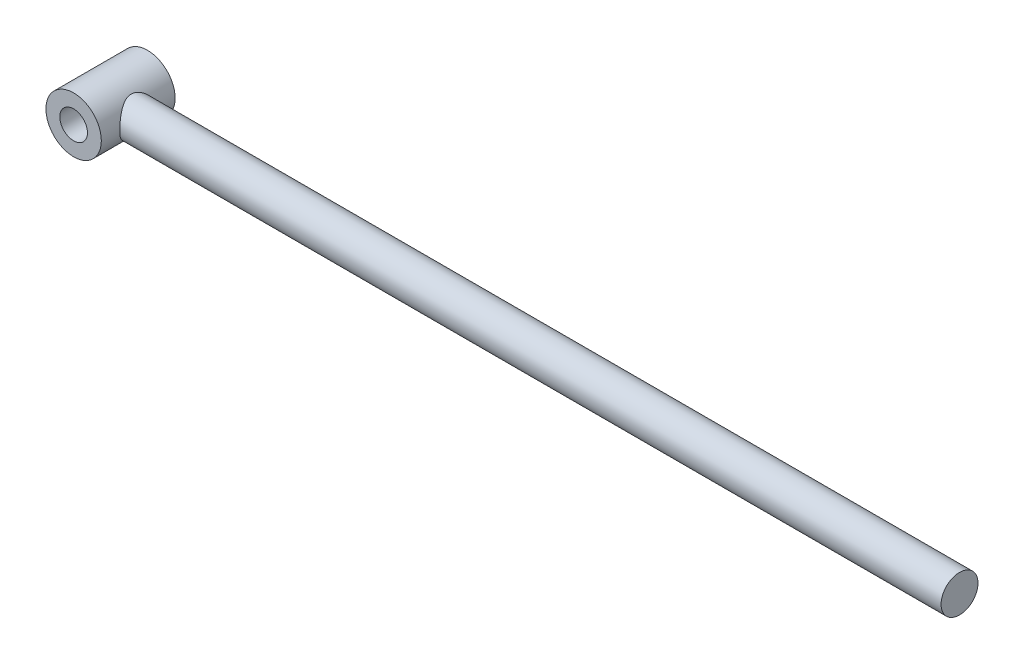
ISO-10303-21;
HEADER;
FILE_DESCRIPTION(('STEP AP214'),'2;1');
FILE_NAME('part.step','',(''),(''),'','','');
FILE_SCHEMA(('AUTOMOTIVE_DESIGN { 1 0 10303 214 1 1 1 1 }'));
ENDSEC;
DATA;
#1=APPLICATION_CONTEXT('core data for automotive mechanical design processes');
#2=APPLICATION_PROTOCOL_DEFINITION('international standard','automotive_design',2000,#1);
#3=PRODUCT_CONTEXT('',#1,'mechanical');
#4=PRODUCT('Part','Part','',(#3));
#5=PRODUCT_RELATED_PRODUCT_CATEGORY('part','',(#4));
#6=PRODUCT_DEFINITION_FORMATION('','',#4);
#7=PRODUCT_DEFINITION_CONTEXT('part definition',#1,'design');
#8=PRODUCT_DEFINITION('design','',#6,#7);
#9=PRODUCT_DEFINITION_SHAPE('','',#8);
#10=(LENGTH_UNIT() NAMED_UNIT(*) SI_UNIT(.MILLI.,.METRE.));
#11=(NAMED_UNIT(*) PLANE_ANGLE_UNIT() SI_UNIT($,.RADIAN.));
#12=(NAMED_UNIT(*) SI_UNIT($,.STERADIAN.) SOLID_ANGLE_UNIT());
#13=UNCERTAINTY_MEASURE_WITH_UNIT(LENGTH_MEASURE(1.E-05),#10,'distance_accuracy_value','');
#14=(GEOMETRIC_REPRESENTATION_CONTEXT(3) GLOBAL_UNCERTAINTY_ASSIGNED_CONTEXT((#13)) GLOBAL_UNIT_ASSIGNED_CONTEXT((#10,
#11,#12)) REPRESENTATION_CONTEXT('',''));
#15=CARTESIAN_POINT('',(0.,0.,0.));
#16=DIRECTION('',(0.,0.,1.));
#17=DIRECTION('',(1.,0.,0.));
#18=AXIS2_PLACEMENT_3D('',#15,#16,#17);
#19=CARTESIAN_POINT('',(0.,0.,40.));
#20=DIRECTION('',(0.,0.,-1.));
#21=DIRECTION('',(-1.,0.,0.));
#22=AXIS2_PLACEMENT_3D('',#19,#20,#21);
#23=CYLINDRICAL_SURFACE('',#22,30.);
#24=CARTESIAN_POINT('',(0.,0.,40.));
#25=DIRECTION('',(0.,0.,1.));
#26=DIRECTION('',(1.,0.,0.));
#27=AXIS2_PLACEMENT_3D('',#24,#25,#26);
#28=CIRCLE('',#27,30.);
#29=CARTESIAN_POINT('',(30.,0.,40.));
#30=VERTEX_POINT('',#29);
#31=EDGE_CURVE('E51',#30,#30,#28,.T.);
#32=ORIENTED_EDGE('',*,*,#31,.F.);
#33=EDGE_LOOP('',(#32));
#34=FACE_BOUND('',#33,.T.);
#35=CARTESIAN_POINT('',(0.,0.,-40.));
#36=DIRECTION('',(0.,0.,1.));
#37=DIRECTION('',(1.,0.,0.));
#38=AXIS2_PLACEMENT_3D('',#35,#36,#37);
#39=CIRCLE('',#38,30.);
#40=CARTESIAN_POINT('',(30.,0.,-40.));
#41=VERTEX_POINT('',#40);
#42=EDGE_CURVE('E56',#41,#41,#39,.T.);
#43=ORIENTED_EDGE('',*,*,#42,.T.);
#44=EDGE_LOOP('',(#43));
#45=FACE_BOUND('',#44,.T.);
#46=CARTESIAN_POINT('',(30.,0.,20.));
#47=CARTESIAN_POINT('',(29.9999998661981,-0.502432050357107,19.9999998708156));
#48=CARTESIAN_POINT('',(29.9873512767924,-1.00486659291617,19.981041890221));
#49=CARTESIAN_POINT('',(29.9370754507124,-2.00562861223446,19.9055087079442));
#50=CARTESIAN_POINT('',(29.8994480825663,-2.50395606736271,19.8489333082686));
#51=CARTESIAN_POINT('',(29.8001252135495,-3.49278874290095,19.6990002879968));
#52=CARTESIAN_POINT('',(29.7384203306489,-3.98329083644028,19.6056283291341));
#53=CARTESIAN_POINT('',(29.5924098661005,-4.9527367018995,19.3834395211629));
#54=CARTESIAN_POINT('',(29.5081040111715,-5.43168033398314,19.2546222434644));
#55=CARTESIAN_POINT('',(29.3192451350848,-6.3726831529905,18.9639204802124));
#56=CARTESIAN_POINT('',(29.2147907649452,-6.83481207132658,18.8021969068242));
#57=CARTESIAN_POINT('',(28.987567335659,-7.74207070686117,18.4471586375469));
#58=CARTESIAN_POINT('',(28.864798371266,-8.18720051199242,18.2538441050984));
#59=CARTESIAN_POINT('',(28.6033482003015,-9.05844037609498,17.8375381124749));
#60=CARTESIAN_POINT('',(28.4646675126729,-9.48455105472426,17.6145476201097));
#61=CARTESIAN_POINT('',(28.1739113247129,-10.3162415378409,17.1407197895657));
#62=CARTESIAN_POINT('',(28.0218342454824,-10.7218189133778,16.88987916806));
#63=CARTESIAN_POINT('',(27.6935578417576,-11.544666651525,16.3397046695659));
#64=CARTESIAN_POINT('',(27.5164065024113,-11.9600134544702,16.0380625153589));
#65=CARTESIAN_POINT('',(27.1528656210948,-12.7638755092378,15.4060039283267));
#66=CARTESIAN_POINT('',(26.9664756598522,-13.1523895414017,15.0755861890756));
#67=CARTESIAN_POINT('',(26.5877396332004,-13.9021114634373,14.3871695519229));
#68=CARTESIAN_POINT('',(26.3953859507486,-14.2632822184454,14.0291344326562));
#69=CARTESIAN_POINT('',(26.0086530551827,-14.9568597365416,13.2872215493219));
#70=CARTESIAN_POINT('',(25.8142737230126,-15.2892647981446,12.9033422589614));
#71=CARTESIAN_POINT('',(25.396836648899,-15.9745417178036,12.0482275933553));
#72=CARTESIAN_POINT('',(25.174096536266,-16.3223586443349,11.5727693191127));
#73=CARTESIAN_POINT('',(24.7376939344548,-16.9764877633748,10.5899657994356));
#74=CARTESIAN_POINT('',(24.5240335140448,-17.2827905315006,10.0826133516483));
#75=CARTESIAN_POINT('',(24.1134541975624,-17.8511644026812,9.03819236671138));
#76=CARTESIAN_POINT('',(23.9165127661255,-18.1132955295477,8.50116549380746));
#77=CARTESIAN_POINT('',(23.5472211433069,-18.5908454263022,7.39870988362545));
#78=CARTESIAN_POINT('',(23.3748591544978,-18.8062866319954,6.83329494920044));
#79=CARTESIAN_POINT('',(23.1083554699939,-19.13202887715,5.84404921175392));
#80=CARTESIAN_POINT('',(23.0059988256492,-19.254726201792,5.42648017350507));
#81=CARTESIAN_POINT('',(22.8211903176783,-19.4734126020971,4.58008091505703));
#82=CARTESIAN_POINT('',(22.7387352052499,-19.5694060373963,4.15125254556424));
#83=CARTESIAN_POINT('',(22.5966842761104,-19.7332623242764,3.28516192271634));
#84=CARTESIAN_POINT('',(22.5370547106277,-19.8011667190628,2.84791313270976));
#85=CARTESIAN_POINT('',(22.442775186748,-19.9079619855319,1.96717747103349));
#86=CARTESIAN_POINT('',(22.4081253652476,-19.9468526982109,1.5236905651906));
#87=CARTESIAN_POINT('',(22.3651578047493,-19.995018995311,0.631973802665962));
#88=CARTESIAN_POINT('',(22.3569497015249,-20.0041712760879,0.183731910267435));
#89=CARTESIAN_POINT('',(22.3675301691013,-19.9923398271623,-0.712030658740458));
#90=CARTESIAN_POINT('',(22.3863188316053,-19.971355995093,-1.15955133289481));
#91=CARTESIAN_POINT('',(22.4501086857203,-19.8996205096492,-2.050625095392));
#92=CARTESIAN_POINT('',(22.4951293541334,-19.8488467375743,-2.49417498677212));
#93=CARTESIAN_POINT('',(22.6095581655225,-19.7184018881212,-3.37377492739303));
#94=CARTESIAN_POINT('',(22.6789667736164,-19.6387302596127,-3.80982483343045));
#95=CARTESIAN_POINT('',(22.8360020403641,-19.4558684710411,-4.65260599507371));
#96=CARTESIAN_POINT('',(22.9226794986437,-19.3538839737256,-5.05977803330656));
#97=CARTESIAN_POINT('',(23.1133089528256,-19.1258219416928,-5.86323587316174));
#98=CARTESIAN_POINT('',(23.2172676308142,-18.9997350845369,-6.25951739443491));
#99=CARTESIAN_POINT('',(23.5509005263236,-18.5870898788947,-7.42993067111853));
#100=CARTESIAN_POINT('',(23.8024209013306,-18.2660472919538,-8.18608179416508));
#101=CARTESIAN_POINT('',(24.2342569329526,-17.6854431992285,-9.35228726673066));
#102=CARTESIAN_POINT('',(24.403077317783,-17.4522559964646,-9.78032481496439));
#103=CARTESIAN_POINT('',(24.7497432705651,-16.9570483876589,-10.6157476442302));
#104=CARTESIAN_POINT('',(24.9275896995493,-16.6950252280375,-11.023130947529));
#105=CARTESIAN_POINT('',(25.2885468949722,-16.1430567151301,-11.8167546644321));
#106=CARTESIAN_POINT('',(25.471663237886,-15.8530809594392,-12.2029713238621));
#107=CARTESIAN_POINT('',(25.8393965051977,-15.246358714758,-12.9530389311317));
#108=CARTESIAN_POINT('',(26.024013528533,-14.9296104475491,-13.3168883905748));
#109=CARTESIAN_POINT('',(26.4310497738324,-14.1989483888887,-14.097303197129));
#110=CARTESIAN_POINT('',(26.6530303956695,-13.7788159652825,-14.5083033678111));
#111=CARTESIAN_POINT('',(27.0885965336176,-12.9014676729698,-15.2937513429522));
#112=CARTESIAN_POINT('',(27.3021805000215,-12.4442450060576,-15.6681924187186));
#113=CARTESIAN_POINT('',(27.7153401348638,-11.4946861176089,-16.3775183221479));
#114=CARTESIAN_POINT('',(27.9149260225621,-11.0023760522687,-16.7124321311584));
#115=CARTESIAN_POINT('',(28.2949676279155,-9.98447354240779,-17.3397652164747));
#116=CARTESIAN_POINT('',(28.4754286055529,-9.45889031296221,-17.6321961852127));
#117=CARTESIAN_POINT('',(28.7791644068812,-8.4833461227497,-18.1181905483136));
#118=CARTESIAN_POINT('',(28.9067147978732,-8.03875717640116,-18.3198975753372));
#119=CARTESIAN_POINT('',(29.1437173052015,-7.13185034835575,-18.691623162803));
#120=CARTESIAN_POINT('',(29.2531715370476,-6.66953454679109,-18.8616454276103));
#121=CARTESIAN_POINT('',(29.4516277514227,-5.7299227277189,-19.1679937956703));
#122=CARTESIAN_POINT('',(29.5406434674396,-5.25263701566193,-19.3043425302522));
#123=CARTESIAN_POINT('',(29.6963305492252,-4.28575432400347,-19.5417523912564));
#124=CARTESIAN_POINT('',(29.7630015712691,-3.79615715514135,-19.6428129748477));
#125=CARTESIAN_POINT('',(29.872657894971,-2.80597314349125,-19.8085733139663));
#126=CARTESIAN_POINT('',(29.9155383206477,-2.30534759903096,-19.8731120951364));
#127=CARTESIAN_POINT('',(29.9760956021539,-1.29911991465958,-19.9641545523483));
#128=CARTESIAN_POINT('',(29.9937724250504,-0.793517768246534,-19.9906581786905));
#129=CARTESIAN_POINT('',(30.0034717951189,0.218464736427053,-20.0052080328604));
#130=CARTESIAN_POINT('',(29.9954953996663,0.724845061752678,-19.9932558457617));
#131=CARTESIAN_POINT('',(29.9540933231667,1.73418156784465,-19.931087455494));
#132=CARTESIAN_POINT('',(29.9206687283027,2.23713789383013,-19.8808728854445));
#133=CARTESIAN_POINT('',(29.8324414506934,3.20042176411033,-19.7478312691314));
#134=CARTESIAN_POINT('',(29.7793090042603,3.66125811656818,-19.6675483452082));
#135=CARTESIAN_POINT('',(29.6529106481444,4.57350157570509,-19.4756341111471));
#136=CARTESIAN_POINT('',(29.5796458717002,5.02490921158323,-19.3640045654864));
#137=CARTESIAN_POINT('',(29.4144446665676,5.91571607198156,-19.1106977521881));
#138=CARTESIAN_POINT('',(29.3225070223762,6.35511451265425,-18.9690185284518));
#139=CARTESIAN_POINT('',(29.1217004947068,7.21966385402625,-18.6571079304231));
#140=CARTESIAN_POINT('',(29.0128307093883,7.64481399436505,-18.486875035266));
#141=CARTESIAN_POINT('',(28.7730488442419,8.50426678457443,-18.1083152340667));
#142=CARTESIAN_POINT('',(28.641201691667,8.93756698372232,-17.8983067263232));
#143=CARTESIAN_POINT('',(28.3631030211141,9.78432512725706,-17.449829798643));
#144=CARTESIAN_POINT('',(28.2168510697156,10.1977824740429,-17.2113605223154));
#145=CARTESIAN_POINT('',(27.9124418593605,11.0036909497809,-16.7076242018634));
#146=CARTESIAN_POINT('',(27.7542793038351,11.3961325988641,-16.4423452174859));
#147=CARTESIAN_POINT('',(27.4287361682711,12.1587990167243,-15.8866695617355));
#148=CARTESIAN_POINT('',(27.2613545613898,12.5290213010131,-15.5962700903114));
#149=CARTESIAN_POINT('',(26.8930879740092,13.3031347178692,-14.9439528947196));
#150=CARTESIAN_POINT('',(26.6910905163229,13.7030923841241,-14.5779874749765));
#151=CARTESIAN_POINT('',(26.2826982946006,14.4709683638239,-13.8160664974289));
#152=CARTESIAN_POINT('',(26.0763029510259,14.8388824217615,-13.4201069693141));
#153=CARTESIAN_POINT('',(25.6635739697582,15.5417880165119,-12.5994023240134));
#154=CARTESIAN_POINT('',(25.4572404691787,15.876757023597,-12.174637839138));
#155=CARTESIAN_POINT('',(25.0497261492331,16.5122275702686,-11.2977646153286));
#156=CARTESIAN_POINT('',(24.8485448051984,16.81273263041,-10.8456586765927));
#157=CARTESIAN_POINT('',(24.4733023029991,17.3538627139578,-9.95448274755281));
#158=CARTESIAN_POINT('',(24.2983863656877,17.5974024349064,-9.51754297050518));
#159=CARTESIAN_POINT('',(23.9619407246742,18.0528546349536,-8.62244520074572));
#160=CARTESIAN_POINT('',(23.8004112149102,18.2647666558762,-8.16428690077693));
#161=CARTESIAN_POINT('',(23.4959190621918,18.6548371117046,-7.22866142786252));
#162=CARTESIAN_POINT('',(23.352929353255,18.8330449293941,-6.75122376801286));
#163=CARTESIAN_POINT('',(23.0904591353035,19.1539484457238,-5.77827480129949));
#164=CARTESIAN_POINT('',(22.9709732247938,19.2966523056608,-5.28276767814733));
#165=CARTESIAN_POINT('',(22.7795445121487,19.5220414226083,-4.36698264384053));
#166=CARTESIAN_POINT('',(22.7029160837044,19.6109049179647,-3.94920001271946));
#167=CARTESIAN_POINT('',(22.5714513943609,19.7620762933325,-3.1054686934564));
#168=CARTESIAN_POINT('',(22.5166125085731,19.82438737206,-2.6795209954077));
#169=CARTESIAN_POINT('',(22.4307802243878,19.9214537495162,-1.8224911908299));
#170=CARTESIAN_POINT('',(22.3997648547817,19.9562344390175,-1.39141418836717));
#171=CARTESIAN_POINT('',(22.3627151772862,19.9977438544737,-0.526818989046352));
#172=CARTESIAN_POINT('',(22.3566812339737,20.0044721710347,-0.093300756653625));
#173=CARTESIAN_POINT('',(22.3698449862022,19.9897505651309,0.773115287328889));
#174=CARTESIAN_POINT('',(22.3890570855061,19.9682845568072,1.20601260355544));
#175=CARTESIAN_POINT('',(22.4519644396444,19.89752521375,2.06770261584204));
#176=CARTESIAN_POINT('',(22.4956594937704,19.8482321071399,2.49649534552171));
#177=CARTESIAN_POINT('',(22.6059284972836,19.7225495457303,3.34758196945676));
#178=CARTESIAN_POINT('',(22.672528474229,19.6461292623078,3.76986789699179));
#179=CARTESIAN_POINT('',(22.8262602119977,19.4672984586528,4.60508117377623));
#180=CARTESIAN_POINT('',(22.9133946099072,19.3648846001243,5.01800731354381));
#181=CARTESIAN_POINT('',(23.1310818906606,19.1046848410163,5.94123169432083));
#182=CARTESIAN_POINT('',(23.2670175183132,18.9394160062732,6.44816076864198));
#183=CARTESIAN_POINT('',(23.5616278122302,18.5716220555323,7.44147650640459));
#184=CARTESIAN_POINT('',(23.7203087439171,18.3690866697139,7.92785746170607));
#185=CARTESIAN_POINT('',(24.0548494900776,17.928768029319,8.87885978411792));
#186=CARTESIAN_POINT('',(24.230727597647,17.6909470983741,9.34345718517344));
#187=CARTESIAN_POINT('',(24.5941802563021,17.1820850766219,10.2491849776676));
#188=CARTESIAN_POINT('',(24.781754189423,16.9110457402246,10.6903166066737));
#189=CARTESIAN_POINT('',(25.1672255632098,16.3319905343255,11.5560455039427));
#190=CARTESIAN_POINT('',(25.3652486390898,16.0233924051234,11.9801968484712));
#191=CARTESIAN_POINT('',(25.7637225763061,15.3745104302451,12.8022908705141));
#192=CARTESIAN_POINT('',(25.9641734317233,15.0342266618099,13.200233611914));
#193=CARTESIAN_POINT('',(26.3632502502894,14.3228973596636,13.9688530344093));
#194=CARTESIAN_POINT('',(26.5618756733661,13.951843028237,14.33952185996));
#195=CARTESIAN_POINT('',(26.9531887772778,13.180017889376,15.0520096270216));
#196=CARTESIAN_POINT('',(27.1458759630328,12.779244613665,15.3938261671826));
#197=CARTESIAN_POINT('',(27.5484327444244,11.8892953412499,16.0937728405199));
#198=CARTESIAN_POINT('',(27.7567878541469,11.3956949938791,16.4471788212645));
#199=CARTESIAN_POINT('',(28.1549839321458,10.372947033489,17.1106254017982));
#200=CARTESIAN_POINT('',(28.3448221999976,9.84379425458726,17.42065967928));
#201=CARTESIAN_POINT('',(28.7002669540513,8.7534583378163,17.9932104380746));
#202=CARTESIAN_POINT('',(28.8659031307225,8.19231563994947,18.2557852367735));
#203=CARTESIAN_POINT('',(29.1680076078479,7.04137086874954,18.7298173077689));
#204=CARTESIAN_POINT('',(29.3044861493112,6.45157894748342,18.9412925311521));
#205=CARTESIAN_POINT('',(29.5171038312658,5.38222751658728,19.2683981125324));
#206=CARTESIAN_POINT('',(29.5999120726272,4.90728446450014,19.3948839484347));
#207=CARTESIAN_POINT('',(29.7432935523992,3.94618639128292,19.6130133782002));
#208=CARTESIAN_POINT('',(29.8038703786017,3.46003319276103,19.7046625942176));
#209=CARTESIAN_POINT('',(29.9013488891663,2.48023551916962,19.8517933612465));
#210=CARTESIAN_POINT('',(29.9382651667603,1.98659585428405,19.9072972061548));
#211=CARTESIAN_POINT('',(29.9875912480541,0.995305041117371,19.9814012816267));
#212=CARTESIAN_POINT('',(30.0000001325294,0.497653743070644,20.0000001279558));
#213=CARTESIAN_POINT('',(30.,0.,20.));
#214=B_SPLINE_CURVE_WITH_KNOTS('',3,(#46,#47,#48,#49,#50,#51,#52,#53,#54,#55,#56,#57,#58,#59,
#60,#61,#62,#63,#64,#65,#66,#67,#68,#69,#70,#71,#72,#73,#74,#75,#76,#77,#78,#79,#80,#81,#82,#83,
#84,#85,#86,#87,#88,#89,#90,#91,#92,#93,#94,#95,#96,#97,#98,#99,#100,#101,#102,#103,#104,#105,
#106,#107,#108,#109,#110,#111,#112,#113,#114,#115,#116,#117,#118,#119,#120,#121,#122,#123,#124,
#125,#126,#127,#128,#129,#130,#131,#132,#133,#134,#135,#136,#137,#138,#139,#140,#141,#142,#143,
#144,#145,#146,#147,#148,#149,#150,#151,#152,#153,#154,#155,#156,#157,#158,#159,#160,#161,#162,
#163,#164,#165,#166,#167,#168,#169,#170,#171,#172,#173,#174,#175,#176,#177,#178,#179,#180,#181,
#182,#183,#184,#185,#186,#187,#188,#189,#190,#191,#192,#193,#194,#195,#196,#197,#198,#199,#200,
#201,#202,#203,#204,#205,#206,#207,#208,#209,#210,#211,#212,#213),.UNSPECIFIED.,.T.,.F.,(4,2,2,
2,2,2,2,2,2,2,2,2,2,2,2,2,2,2,2,2,2,2,2,2,2,2,2,2,2,2,2,2,2,2,2,2,2,2,2,2,2,2,2,2,2,2,2,2,2,2,2,
2,2,2,2,2,2,2,2,2,2,2,2,2,2,2,2,2,2,2,2,2,2,2,2,2,2,2,2,2,2,2,2,4),(0.,1.50678860030269,
3.01358513141216,4.52096938721657,6.02837187047945,7.52857302893605,9.02876642612416,
10.5289109101103,12.0292324383504,13.6567444840869,15.284330458243,16.9140886133164,
18.5439431024577,20.431131930561,22.3187484658921,24.2037789087041,26.0879015235946,
27.4279650999174,28.7678097709498,30.1056656880386,31.4435289369311,32.7869323000986,
34.1303402265693,35.4747468830929,36.8191791810432,38.1037263431644,39.3887713582513,
41.9574635192448,43.5039572638651,45.0505988133526,46.5989419535985,48.1473880150574,
50.0299431140749,51.9128440463346,53.7943557465543,55.6753486185392,57.1876211138398,
58.6997166935429,60.2107932404063,61.7218930308516,63.2396023156496,64.7573135836025,
66.2749622952646,67.7925462340977,69.2033177886316,70.6140099478306,72.0247939649324,
73.4356531490233,74.9318700392892,76.4281319624119,77.9250632379934,79.4221615843148,
81.1559974776003,82.8900632805819,84.6253068106235,86.3603729242013,87.9487273830719,
89.5371048494666,91.1231367124568,92.7088036566569,94.0093258243475,95.3096912764256,
96.6088560233589,97.9080397301251,99.2079649891922,100.507879591774,101.809276234171,
103.110840096639,104.759184673476,106.407984179069,108.058557042328,109.70904276911,
111.389510486189,113.069974106853,114.750919862111,116.432005383304,118.354868197109,
120.278011015838,122.198774401875,124.118862046836,125.61242765333,127.105752116314,
128.598154645697,130.090613151129),.UNSPECIFIED.);
#215=CARTESIAN_POINT('',(30.,0.,20.));
#216=VERTEX_POINT('',#215);
#217=EDGE_CURVE('E10',#216,#216,#214,.T.);
#218=ORIENTED_EDGE('',*,*,#217,.F.);
#219=EDGE_LOOP('',(#218));
#220=FACE_BOUND('',#219,.T.);
#221=ADVANCED_FACE('F39',(#34,#45,#220),#23,.T.);
#222=CARTESIAN_POINT('',(0.,0.,40.));
#223=DIRECTION('',(0.,0.,1.));
#224=DIRECTION('',(1.,0.,0.));
#225=AXIS2_PLACEMENT_3D('',#222,#223,#224);
#226=PLANE('',#225);
#227=ORIENTED_EDGE('',*,*,#31,.T.);
#228=EDGE_LOOP('',(#227));
#229=FACE_BOUND('',#228,.T.);
#230=CARTESIAN_POINT('',(0.,0.,40.));
#231=DIRECTION('',(0.,0.,1.));
#232=DIRECTION('',(1.,0.,0.));
#233=AXIS2_PLACEMENT_3D('',#230,#231,#232);
#234=CIRCLE('',#233,15.);
#235=CARTESIAN_POINT('',(15.,0.,40.));
#236=VERTEX_POINT('',#235);
#237=EDGE_CURVE('E62',#236,#236,#234,.T.);
#238=ORIENTED_EDGE('',*,*,#237,.F.);
#239=EDGE_LOOP('',(#238));
#240=FACE_BOUND('',#239,.T.);
#241=ADVANCED_FACE('F91',(#229,#240),#226,.T.);
#242=CARTESIAN_POINT('',(0.,0.,-40.));
#243=DIRECTION('',(0.,0.,1.));
#244=DIRECTION('',(1.,0.,0.));
#245=AXIS2_PLACEMENT_3D('',#242,#243,#244);
#246=PLANE('',#245);
#247=ORIENTED_EDGE('',*,*,#42,.F.);
#248=EDGE_LOOP('',(#247));
#249=FACE_BOUND('',#248,.T.);
#250=CARTESIAN_POINT('',(0.,0.,-40.));
#251=DIRECTION('',(0.,0.,1.));
#252=DIRECTION('',(1.,0.,0.));
#253=AXIS2_PLACEMENT_3D('',#250,#251,#252);
#254=CIRCLE('',#253,15.);
#255=CARTESIAN_POINT('',(15.,0.,-40.));
#256=VERTEX_POINT('',#255);
#257=EDGE_CURVE('E64',#256,#256,#254,.T.);
#258=ORIENTED_EDGE('',*,*,#257,.T.);
#259=EDGE_LOOP('',(#258));
#260=FACE_BOUND('',#259,.T.);
#261=ADVANCED_FACE('F86',(#249,#260),#246,.F.);
#262=CARTESIAN_POINT('',(0.,0.,40.));
#263=DIRECTION('',(0.,0.,-1.));
#264=DIRECTION('',(-1.,0.,0.));
#265=AXIS2_PLACEMENT_3D('',#262,#263,#264);
#266=CYLINDRICAL_SURFACE('',#265,15.);
#267=ORIENTED_EDGE('',*,*,#237,.T.);
#268=EDGE_LOOP('',(#267));
#269=FACE_BOUND('',#268,.T.);
#270=ORIENTED_EDGE('',*,*,#257,.F.);
#271=EDGE_LOOP('',(#270));
#272=FACE_BOUND('',#271,.T.);
#273=ADVANCED_FACE('F80',(#269,#272),#266,.F.);
#274=CARTESIAN_POINT('',(920.,0.,0.));
#275=DIRECTION('',(-1.,0.,0.));
#276=DIRECTION('',(0.,0.,1.));
#277=AXIS2_PLACEMENT_3D('',#274,#275,#276);
#278=CYLINDRICAL_SURFACE('',#277,20.);
#279=CARTESIAN_POINT('',(920.,0.,0.));
#280=DIRECTION('',(1.,0.,0.));
#281=DIRECTION('',(0.,0.,-1.));
#282=AXIS2_PLACEMENT_3D('',#279,#280,#281);
#283=CIRCLE('',#282,20.);
#284=CARTESIAN_POINT('',(920.,0.,-20.));
#285=VERTEX_POINT('',#284);
#286=EDGE_CURVE('E68',#285,#285,#283,.T.);
#287=ORIENTED_EDGE('',*,*,#286,.F.);
#288=EDGE_LOOP('',(#287));
#289=FACE_BOUND('',#288,.T.);
#290=ORIENTED_EDGE('',*,*,#217,.T.);
#291=EDGE_LOOP('',(#290));
#292=FACE_BOUND('',#291,.T.);
#293=ADVANCED_FACE('F78',(#289,#292),#278,.T.);
#294=CARTESIAN_POINT('',(920.,0.,0.));
#295=DIRECTION('',(1.,0.,0.));
#296=DIRECTION('',(0.,0.,-1.));
#297=AXIS2_PLACEMENT_3D('',#294,#295,#296);
#298=PLANE('',#297);
#299=ORIENTED_EDGE('',*,*,#286,.T.);
#300=EDGE_LOOP('',(#299));
#301=FACE_BOUND('',#300,.T.);
#302=ADVANCED_FACE('F76',(#301),#298,.T.);
#303=CLOSED_SHELL('',(#221,#241,#261,#273,#293,#302));
#304=MANIFOLD_SOLID_BREP('B2',#303);
#305=ADVANCED_BREP_SHAPE_REPRESENTATION('',(#18,#304),#14);
#306=SHAPE_DEFINITION_REPRESENTATION(#9,#305);
ENDSEC;
END-ISO-10303-21;
